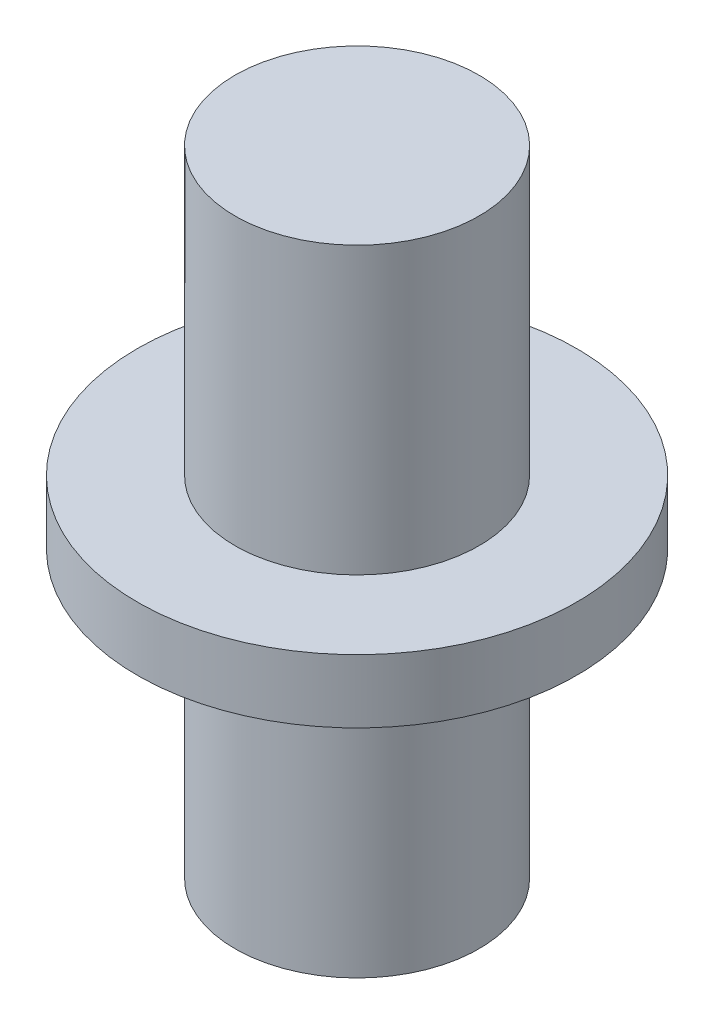
ISO-10303-21;
HEADER;
FILE_DESCRIPTION(('STEP AP214'),'2;1');
FILE_NAME('part.step','',(''),(''),'','','');
FILE_SCHEMA(('AUTOMOTIVE_DESIGN { 1 0 10303 214 1 1 1 1 }'));
ENDSEC;
DATA;
#1=APPLICATION_CONTEXT('core data for automotive mechanical design processes');
#2=APPLICATION_PROTOCOL_DEFINITION('international standard','automotive_design',2000,#1);
#3=PRODUCT_CONTEXT('',#1,'mechanical');
#4=PRODUCT('Part','Part','',(#3));
#5=PRODUCT_RELATED_PRODUCT_CATEGORY('part','',(#4));
#6=PRODUCT_DEFINITION_FORMATION('','',#4);
#7=PRODUCT_DEFINITION_CONTEXT('part definition',#1,'design');
#8=PRODUCT_DEFINITION('design','',#6,#7);
#9=PRODUCT_DEFINITION_SHAPE('','',#8);
#10=(LENGTH_UNIT() NAMED_UNIT(*) SI_UNIT(.MILLI.,.METRE.));
#11=(NAMED_UNIT(*) PLANE_ANGLE_UNIT() SI_UNIT($,.RADIAN.));
#12=(NAMED_UNIT(*) SI_UNIT($,.STERADIAN.) SOLID_ANGLE_UNIT());
#13=UNCERTAINTY_MEASURE_WITH_UNIT(LENGTH_MEASURE(1.E-05),#10,'distance_accuracy_value','');
#14=(GEOMETRIC_REPRESENTATION_CONTEXT(3) GLOBAL_UNCERTAINTY_ASSIGNED_CONTEXT((#13)) GLOBAL_UNIT_ASSIGNED_CONTEXT((#10,
#11,#12)) REPRESENTATION_CONTEXT('',''));
#15=CARTESIAN_POINT('',(0.,0.,0.));
#16=DIRECTION('',(0.,0.,1.));
#17=DIRECTION('',(1.,0.,0.));
#18=AXIS2_PLACEMENT_3D('',#15,#16,#17);
#19=CARTESIAN_POINT('',(0.,13.,0.));
#20=DIRECTION('',(0.,-1.,0.));
#21=DIRECTION('',(1.,0.,0.));
#22=AXIS2_PLACEMENT_3D('',#19,#20,#21);
#23=PLANE('',#22);
#24=CARTESIAN_POINT('',(0.,13.,0.));
#25=DIRECTION('',(0.,1.,0.));
#26=DIRECTION('',(-1.,0.,0.));
#27=AXIS2_PLACEMENT_3D('',#24,#25,#26);
#28=CIRCLE('',#27,2.5);
#29=CARTESIAN_POINT('',(-2.5,13.,0.));
#30=VERTEX_POINT('',#29);
#31=EDGE_CURVE('E10',#30,#30,#28,.T.);
#32=ORIENTED_EDGE('',*,*,#31,.T.);
#33=EDGE_LOOP('',(#32));
#34=FACE_BOUND('',#33,.T.);
#35=ADVANCED_FACE('F37',(#34),#23,.F.);
#36=CARTESIAN_POINT('',(0.,13.,0.));
#37=DIRECTION('',(0.,1.,0.));
#38=DIRECTION('',(-1.,0.,0.));
#39=AXIS2_PLACEMENT_3D('',#36,#37,#38);
#40=CYLINDRICAL_SURFACE('',#39,2.5);
#41=ORIENTED_EDGE('',*,*,#31,.F.);
#42=EDGE_LOOP('',(#41));
#43=FACE_BOUND('',#42,.T.);
#44=CARTESIAN_POINT('',(0.,7.15,0.));
#45=DIRECTION('',(0.,1.,0.));
#46=DIRECTION('',(-1.,0.,0.));
#47=AXIS2_PLACEMENT_3D('',#44,#45,#46);
#48=CIRCLE('',#47,2.5);
#49=CARTESIAN_POINT('',(-2.5,7.15,0.));
#50=VERTEX_POINT('',#49);
#51=EDGE_CURVE('E44',#50,#50,#48,.T.);
#52=ORIENTED_EDGE('',*,*,#51,.T.);
#53=EDGE_LOOP('',(#52));
#54=FACE_BOUND('',#53,.T.);
#55=ADVANCED_FACE('F81',(#43,#54),#40,.T.);
#56=CARTESIAN_POINT('',(2.5,7.15,0.));
#57=DIRECTION('',(0.,-1.,0.));
#58=DIRECTION('',(1.,0.,0.));
#59=AXIS2_PLACEMENT_3D('',#56,#57,#58);
#60=PLANE('',#59);
#61=ORIENTED_EDGE('',*,*,#51,.F.);
#62=EDGE_LOOP('',(#61));
#63=FACE_BOUND('',#62,.T.);
#64=CARTESIAN_POINT('',(0.,7.15,0.));
#65=DIRECTION('',(0.,1.,0.));
#66=DIRECTION('',(-1.,0.,0.));
#67=AXIS2_PLACEMENT_3D('',#64,#65,#66);
#68=CIRCLE('',#67,4.5);
#69=CARTESIAN_POINT('',(-4.5,7.15,0.));
#70=VERTEX_POINT('',#69);
#71=EDGE_CURVE('E49',#70,#70,#68,.T.);
#72=ORIENTED_EDGE('',*,*,#71,.T.);
#73=EDGE_LOOP('',(#72));
#74=FACE_BOUND('',#73,.T.);
#75=ADVANCED_FACE('F85',(#63,#74),#60,.F.);
#76=CARTESIAN_POINT('',(0.,13.,0.));
#77=DIRECTION('',(0.,1.,0.));
#78=DIRECTION('',(-1.,0.,0.));
#79=AXIS2_PLACEMENT_3D('',#76,#77,#78);
#80=CYLINDRICAL_SURFACE('',#79,4.5);
#81=ORIENTED_EDGE('',*,*,#71,.F.);
#82=EDGE_LOOP('',(#81));
#83=FACE_BOUND('',#82,.T.);
#84=CARTESIAN_POINT('',(0.,5.85,0.));
#85=DIRECTION('',(0.,1.,0.));
#86=DIRECTION('',(-1.,0.,0.));
#87=AXIS2_PLACEMENT_3D('',#84,#85,#86);
#88=CIRCLE('',#87,4.5);
#89=CARTESIAN_POINT('',(-4.5,5.85,0.));
#90=VERTEX_POINT('',#89);
#91=EDGE_CURVE('E54',#90,#90,#88,.T.);
#92=ORIENTED_EDGE('',*,*,#91,.T.);
#93=EDGE_LOOP('',(#92));
#94=FACE_BOUND('',#93,.T.);
#95=ADVANCED_FACE('F90',(#83,#94),#80,.T.);
#96=CARTESIAN_POINT('',(4.5,5.85,0.));
#97=DIRECTION('',(0.,1.,0.));
#98=DIRECTION('',(-1.,0.,0.));
#99=AXIS2_PLACEMENT_3D('',#96,#97,#98);
#100=PLANE('',#99);
#101=ORIENTED_EDGE('',*,*,#91,.F.);
#102=EDGE_LOOP('',(#101));
#103=FACE_BOUND('',#102,.T.);
#104=CARTESIAN_POINT('',(0.,5.85,0.));
#105=DIRECTION('',(0.,1.,0.));
#106=DIRECTION('',(-1.,0.,0.));
#107=AXIS2_PLACEMENT_3D('',#104,#105,#106);
#108=CIRCLE('',#107,2.5);
#109=CARTESIAN_POINT('',(-2.5,5.85,0.));
#110=VERTEX_POINT('',#109);
#111=EDGE_CURVE('E60',#110,#110,#108,.T.);
#112=ORIENTED_EDGE('',*,*,#111,.T.);
#113=EDGE_LOOP('',(#112));
#114=FACE_BOUND('',#113,.T.);
#115=ADVANCED_FACE('F77',(#103,#114),#100,.F.);
#116=CARTESIAN_POINT('',(0.,13.,0.));
#117=DIRECTION('',(0.,1.,0.));
#118=DIRECTION('',(-1.,0.,0.));
#119=AXIS2_PLACEMENT_3D('',#116,#117,#118);
#120=CYLINDRICAL_SURFACE('',#119,2.5);
#121=ORIENTED_EDGE('',*,*,#111,.F.);
#122=EDGE_LOOP('',(#121));
#123=FACE_BOUND('',#122,.T.);
#124=CARTESIAN_POINT('',(0.,0.,0.));
#125=DIRECTION('',(0.,1.,0.));
#126=DIRECTION('',(-1.,0.,0.));
#127=AXIS2_PLACEMENT_3D('',#124,#125,#126);
#128=CIRCLE('',#127,2.5);
#129=CARTESIAN_POINT('',(-2.5,0.,0.));
#130=VERTEX_POINT('',#129);
#131=EDGE_CURVE('E64',#130,#130,#128,.T.);
#132=ORIENTED_EDGE('',*,*,#131,.T.);
#133=EDGE_LOOP('',(#132));
#134=FACE_BOUND('',#133,.T.);
#135=ADVANCED_FACE('F69',(#123,#134),#120,.T.);
#136=CARTESIAN_POINT('',(2.5,0.,0.));
#137=DIRECTION('',(0.,1.,0.));
#138=DIRECTION('',(-1.,0.,0.));
#139=AXIS2_PLACEMENT_3D('',#136,#137,#138);
#140=PLANE('',#139);
#141=ORIENTED_EDGE('',*,*,#131,.F.);
#142=EDGE_LOOP('',(#141));
#143=FACE_BOUND('',#142,.T.);
#144=ADVANCED_FACE('F71',(#143),#140,.F.);
#145=CLOSED_SHELL('',(#35,#55,#75,#95,#115,#135,#144));
#146=MANIFOLD_SOLID_BREP('B2',#145);
#147=ADVANCED_BREP_SHAPE_REPRESENTATION('',(#18,#146),#14);
#148=SHAPE_DEFINITION_REPRESENTATION(#9,#147);
ENDSEC;
END-ISO-10303-21;
